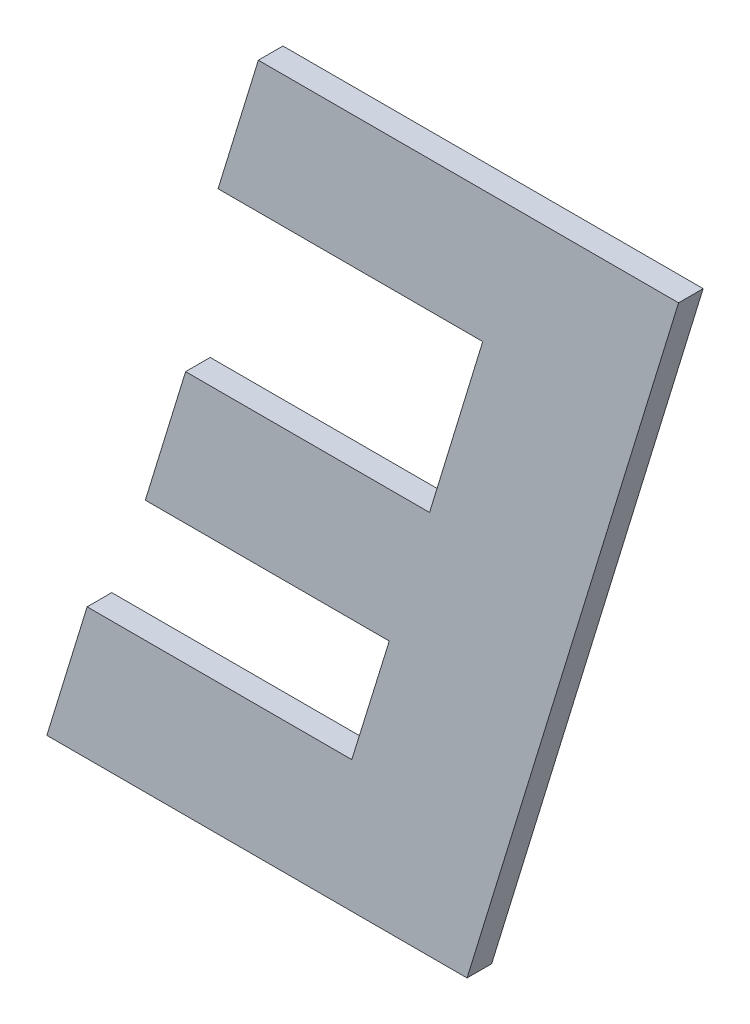
ISO-10303-21;
HEADER;
FILE_DESCRIPTION(('STEP AP214'),'2;1');
FILE_NAME('part.step','',(''),(''),'','','');
FILE_SCHEMA(('AUTOMOTIVE_DESIGN { 1 0 10303 214 1 1 1 1 }'));
ENDSEC;
DATA;
#1=APPLICATION_CONTEXT('core data for automotive mechanical design processes');
#2=APPLICATION_PROTOCOL_DEFINITION('international standard','automotive_design',2000,#1);
#3=PRODUCT_CONTEXT('',#1,'mechanical');
#4=PRODUCT('Part','Part','',(#3));
#5=PRODUCT_RELATED_PRODUCT_CATEGORY('part','',(#4));
#6=PRODUCT_DEFINITION_FORMATION('','',#4);
#7=PRODUCT_DEFINITION_CONTEXT('part definition',#1,'design');
#8=PRODUCT_DEFINITION('design','',#6,#7);
#9=PRODUCT_DEFINITION_SHAPE('','',#8);
#10=(LENGTH_UNIT() NAMED_UNIT(*) SI_UNIT(.MILLI.,.METRE.));
#11=(NAMED_UNIT(*) PLANE_ANGLE_UNIT() SI_UNIT($,.RADIAN.));
#12=(NAMED_UNIT(*) SI_UNIT($,.STERADIAN.) SOLID_ANGLE_UNIT());
#13=UNCERTAINTY_MEASURE_WITH_UNIT(LENGTH_MEASURE(1.E-05),#10,'distance_accuracy_value','');
#14=(GEOMETRIC_REPRESENTATION_CONTEXT(3) GLOBAL_UNCERTAINTY_ASSIGNED_CONTEXT((#13)) GLOBAL_UNIT_ASSIGNED_CONTEXT((#10,
#11,#12)) REPRESENTATION_CONTEXT('',''));
#15=CARTESIAN_POINT('',(0.,0.,0.));
#16=DIRECTION('',(0.,0.,1.));
#17=DIRECTION('',(1.,0.,0.));
#18=AXIS2_PLACEMENT_3D('',#15,#16,#17);
#19=CARTESIAN_POINT('',(-3.756402329819,-2.490905102371,0.));
#20=DIRECTION('',(0.,-1.,0.));
#21=DIRECTION('',(1.,0.,0.));
#22=AXIS2_PLACEMENT_3D('',#19,#20,#21);
#23=PLANE('',#22);
#24=DIRECTION('',(-1.,0.,0.));
#25=VECTOR('',#24,1.);
#26=CARTESIAN_POINT('',(-2.047481656679,-2.490905102371,0.));
#27=LINE('',#26,#25);
#28=CARTESIAN_POINT('',(-2.047481656679,-2.490905102371,0.));
#29=VERTEX_POINT('',#28);
#30=CARTESIAN_POINT('',(-3.756402329819,-2.490905102371,0.));
#31=VERTEX_POINT('',#30);
#32=EDGE_CURVE('E11',#29,#31,#27,.T.);
#33=ORIENTED_EDGE('',*,*,#32,.F.);
#34=DIRECTION('',(0.,0.,1.));
#35=VECTOR('',#34,1.);
#36=CARTESIAN_POINT('',(-2.047481656679,-2.490905102371,0.));
#37=LINE('',#36,#35);
#38=CARTESIAN_POINT('',(-2.047481656679,-2.490905102371,0.1));
#39=VERTEX_POINT('',#38);
#40=EDGE_CURVE('E24',#29,#39,#37,.T.);
#41=ORIENTED_EDGE('',*,*,#40,.T.);
#42=DIRECTION('',(1.,0.,0.));
#43=VECTOR('',#42,1.);
#44=CARTESIAN_POINT('',(-2.047481656679,-2.490905102371,0.1));
#45=LINE('',#44,#43);
#46=CARTESIAN_POINT('',(-3.756402329819,-2.490905102371,0.1));
#47=VERTEX_POINT('',#46);
#48=EDGE_CURVE('E124',#47,#39,#45,.T.);
#49=ORIENTED_EDGE('',*,*,#48,.F.);
#50=DIRECTION('',(0.,0.,1.));
#51=VECTOR('',#50,1.);
#52=CARTESIAN_POINT('',(-3.756402329819,-2.490905102371,0.));
#53=LINE('',#52,#51);
#54=EDGE_CURVE('E197',#31,#47,#53,.T.);
#55=ORIENTED_EDGE('',*,*,#54,.F.);
#56=EDGE_LOOP('',(#33,#41,#49,#55));
#57=FACE_BOUND('',#56,.T.);
#58=ADVANCED_FACE('F17',(#57),#23,.T.);
#59=CARTESIAN_POINT('',(-3.592564395776,-1.956156289871,0.));
#60=DIRECTION('',(-0.956130206843128,0.292942020820021,0.));
#61=DIRECTION('',(-0.292942020820021,-0.956130206843128,0.));
#62=AXIS2_PLACEMENT_3D('',#59,#60,#61);
#63=PLANE('',#62);
#64=DIRECTION('',(0.292942020820021,0.956130206843128,0.));
#65=VECTOR('',#64,1.);
#66=CARTESIAN_POINT('',(-3.756402329819,-2.490905102371,0.));
#67=LINE('',#66,#65);
#68=CARTESIAN_POINT('',(-3.592564395776,-1.956156289871,0.));
#69=VERTEX_POINT('',#68);
#70=EDGE_CURVE('E195',#31,#69,#67,.T.);
#71=ORIENTED_EDGE('',*,*,#70,.F.);
#72=ORIENTED_EDGE('',*,*,#54,.T.);
#73=DIRECTION('',(-0.292942020820021,-0.956130206843128,0.));
#74=VECTOR('',#73,1.);
#75=CARTESIAN_POINT('',(-3.756402329819,-2.490905102371,0.1));
#76=LINE('',#75,#74);
#77=CARTESIAN_POINT('',(-3.592564395776,-1.956156289871,0.1));
#78=VERTEX_POINT('',#77);
#79=EDGE_CURVE('E193',#78,#47,#76,.T.);
#80=ORIENTED_EDGE('',*,*,#79,.F.);
#81=DIRECTION('',(0.,0.,1.));
#82=VECTOR('',#81,1.);
#83=CARTESIAN_POINT('',(-3.592564395776,-1.956156289871,0.));
#84=LINE('',#83,#82);
#85=EDGE_CURVE('E190',#69,#78,#84,.T.);
#86=ORIENTED_EDGE('',*,*,#85,.F.);
#87=EDGE_LOOP('',(#71,#72,#80,#86));
#88=FACE_BOUND('',#87,.T.);
#89=ADVANCED_FACE('F235',(#88),#63,.T.);
#90=CARTESIAN_POINT('',(-2.51624019019,-1.956156289871,0.));
#91=DIRECTION('',(0.,1.,0.));
#92=DIRECTION('',(-1.,0.,0.));
#93=AXIS2_PLACEMENT_3D('',#90,#91,#92);
#94=PLANE('',#93);
#95=DIRECTION('',(1.,0.,0.));
#96=VECTOR('',#95,1.);
#97=CARTESIAN_POINT('',(-3.592564395776,-1.956156289871,0.));
#98=LINE('',#97,#96);
#99=CARTESIAN_POINT('',(-2.51624019019,-1.956156289871,0.));
#100=VERTEX_POINT('',#99);
#101=EDGE_CURVE('E188',#69,#100,#98,.T.);
#102=ORIENTED_EDGE('',*,*,#101,.F.);
#103=ORIENTED_EDGE('',*,*,#85,.T.);
#104=DIRECTION('',(-1.,0.,0.));
#105=VECTOR('',#104,1.);
#106=CARTESIAN_POINT('',(-3.592564395776,-1.956156289871,0.1));
#107=LINE('',#106,#105);
#108=CARTESIAN_POINT('',(-2.51624019019,-1.956156289871,0.1));
#109=VERTEX_POINT('',#108);
#110=EDGE_CURVE('E185',#109,#78,#107,.T.);
#111=ORIENTED_EDGE('',*,*,#110,.F.);
#112=DIRECTION('',(0.,0.,1.));
#113=VECTOR('',#112,1.);
#114=CARTESIAN_POINT('',(-2.51624019019,-1.956156289871,0.));
#115=LINE('',#114,#113);
#116=EDGE_CURVE('E182',#100,#109,#115,.T.);
#117=ORIENTED_EDGE('',*,*,#116,.F.);
#118=EDGE_LOOP('',(#102,#103,#111,#117));
#119=FACE_BOUND('',#118,.T.);
#120=ADVANCED_FACE('F231',(#119),#94,.T.);
#121=CARTESIAN_POINT('',(-2.363779890456,-1.462366960881,0.));
#122=DIRECTION('',(-0.955492945435698,0.295013950894893,0.));
#123=DIRECTION('',(-0.295013950894893,-0.955492945435698,0.));
#124=AXIS2_PLACEMENT_3D('',#121,#122,#123);
#125=PLANE('',#124);
#126=DIRECTION('',(0.295013950894893,0.955492945435698,0.));
#127=VECTOR('',#126,1.);
#128=CARTESIAN_POINT('',(-2.51624019019,-1.956156289871,0.));
#129=LINE('',#128,#127);
#130=CARTESIAN_POINT('',(-2.363779890456,-1.462366960881,0.));
#131=VERTEX_POINT('',#130);
#132=EDGE_CURVE('E180',#100,#131,#129,.T.);
#133=ORIENTED_EDGE('',*,*,#132,.F.);
#134=ORIENTED_EDGE('',*,*,#116,.T.);
#135=DIRECTION('',(-0.295013950894893,-0.955492945435698,0.));
#136=VECTOR('',#135,1.);
#137=CARTESIAN_POINT('',(-2.51624019019,-1.956156289871,0.1));
#138=LINE('',#137,#136);
#139=CARTESIAN_POINT('',(-2.363779890456,-1.462366960881,0.1));
#140=VERTEX_POINT('',#139);
#141=EDGE_CURVE('E177',#140,#109,#138,.T.);
#142=ORIENTED_EDGE('',*,*,#141,.F.);
#143=DIRECTION('',(0.,0.,1.));
#144=VECTOR('',#143,1.);
#145=CARTESIAN_POINT('',(-2.363779890456,-1.462366960881,0.));
#146=LINE('',#145,#144);
#147=EDGE_CURVE('E174',#131,#140,#146,.T.);
#148=ORIENTED_EDGE('',*,*,#147,.F.);
#149=EDGE_LOOP('',(#133,#134,#142,#148));
#150=FACE_BOUND('',#149,.T.);
#151=ADVANCED_FACE('F227',(#150),#125,.T.);
#152=CARTESIAN_POINT('',(-3.355909602159,-1.462366960881,0.));
#153=DIRECTION('',(0.,-1.,0.));
#154=DIRECTION('',(1.,0.,0.));
#155=AXIS2_PLACEMENT_3D('',#152,#153,#154);
#156=PLANE('',#155);
#157=DIRECTION('',(-1.,0.,0.));
#158=VECTOR('',#157,1.);
#159=CARTESIAN_POINT('',(-2.363779890456,-1.462366960881,0.));
#160=LINE('',#159,#158);
#161=CARTESIAN_POINT('',(-3.355909602159,-1.462366960881,0.));
#162=VERTEX_POINT('',#161);
#163=EDGE_CURVE('E172',#131,#162,#160,.T.);
#164=ORIENTED_EDGE('',*,*,#163,.F.);
#165=ORIENTED_EDGE('',*,*,#147,.T.);
#166=DIRECTION('',(1.,0.,0.));
#167=VECTOR('',#166,1.);
#168=CARTESIAN_POINT('',(-2.363779890456,-1.462366960881,0.1));
#169=LINE('',#168,#167);
#170=CARTESIAN_POINT('',(-3.355909602159,-1.462366960881,0.1));
#171=VERTEX_POINT('',#170);
#172=EDGE_CURVE('E169',#171,#140,#169,.T.);
#173=ORIENTED_EDGE('',*,*,#172,.F.);
#174=DIRECTION('',(0.,0.,1.));
#175=VECTOR('',#174,1.);
#176=CARTESIAN_POINT('',(-3.355909602159,-1.462366960881,0.));
#177=LINE('',#176,#175);
#178=EDGE_CURVE('E166',#162,#171,#177,.T.);
#179=ORIENTED_EDGE('',*,*,#178,.F.);
#180=EDGE_LOOP('',(#164,#165,#173,#179));
#181=FACE_BOUND('',#180,.T.);
#182=ADVANCED_FACE('F223',(#181),#156,.T.);
#183=CARTESIAN_POINT('',(-3.192071668116,-0.9276181483808,0.));
#184=DIRECTION('',(-0.956130206843128,0.292942020820021,0.));
#185=DIRECTION('',(-0.292942020820021,-0.956130206843128,0.));
#186=AXIS2_PLACEMENT_3D('',#183,#184,#185);
#187=PLANE('',#186);
#188=DIRECTION('',(0.292942020820021,0.956130206843128,0.));
#189=VECTOR('',#188,1.);
#190=CARTESIAN_POINT('',(-3.355909602159,-1.462366960881,0.));
#191=LINE('',#190,#189);
#192=CARTESIAN_POINT('',(-3.192071668116,-0.9276181483808,0.));
#193=VERTEX_POINT('',#192);
#194=EDGE_CURVE('E164',#162,#193,#191,.T.);
#195=ORIENTED_EDGE('',*,*,#194,.F.);
#196=ORIENTED_EDGE('',*,*,#178,.T.);
#197=DIRECTION('',(-0.292942020820021,-0.956130206843128,0.));
#198=VECTOR('',#197,1.);
#199=CARTESIAN_POINT('',(-3.355909602159,-1.462366960881,0.1));
#200=LINE('',#199,#198);
#201=CARTESIAN_POINT('',(-3.192071668116,-0.9276181483808,0.1));
#202=VERTEX_POINT('',#201);
#203=EDGE_CURVE('E161',#202,#171,#200,.T.);
#204=ORIENTED_EDGE('',*,*,#203,.F.);
#205=DIRECTION('',(0.,0.,1.));
#206=VECTOR('',#205,1.);
#207=CARTESIAN_POINT('',(-3.192071668116,-0.9276181483808,0.));
#208=LINE('',#207,#206);
#209=EDGE_CURVE('E158',#193,#202,#208,.T.);
#210=ORIENTED_EDGE('',*,*,#209,.F.);
#211=EDGE_LOOP('',(#195,#196,#204,#210));
#212=FACE_BOUND('',#211,.T.);
#213=ADVANCED_FACE('F219',(#212),#187,.T.);
#214=CARTESIAN_POINT('',(-2.199941956413,-0.9276181483808,0.));
#215=DIRECTION('',(0.,1.,0.));
#216=DIRECTION('',(-1.,0.,0.));
#217=AXIS2_PLACEMENT_3D('',#214,#215,#216);
#218=PLANE('',#217);
#219=DIRECTION('',(1.,0.,0.));
#220=VECTOR('',#219,1.);
#221=CARTESIAN_POINT('',(-3.192071668116,-0.9276181483808,0.));
#222=LINE('',#221,#220);
#223=CARTESIAN_POINT('',(-2.199941956413,-0.9276181483808,0.));
#224=VERTEX_POINT('',#223);
#225=EDGE_CURVE('E156',#193,#224,#222,.T.);
#226=ORIENTED_EDGE('',*,*,#225,.F.);
#227=ORIENTED_EDGE('',*,*,#209,.T.);
#228=DIRECTION('',(-1.,0.,0.));
#229=VECTOR('',#228,1.);
#230=CARTESIAN_POINT('',(-3.192071668116,-0.9276181483808,0.1));
#231=LINE('',#230,#229);
#232=CARTESIAN_POINT('',(-2.199941956413,-0.9276181483808,0.1));
#233=VERTEX_POINT('',#232);
#234=EDGE_CURVE('E153',#233,#202,#231,.T.);
#235=ORIENTED_EDGE('',*,*,#234,.F.);
#236=DIRECTION('',(0.,0.,1.));
#237=VECTOR('',#236,1.);
#238=CARTESIAN_POINT('',(-2.199941956413,-0.9276181483808,0.));
#239=LINE('',#238,#237);
#240=EDGE_CURVE('E150',#224,#233,#239,.T.);
#241=ORIENTED_EDGE('',*,*,#240,.F.);
#242=EDGE_LOOP('',(#226,#227,#235,#241));
#243=FACE_BOUND('',#242,.T.);
#244=ADVANCED_FACE('F215',(#243),#218,.T.);
#245=CARTESIAN_POINT('',(-1.983766904551,-0.217653767529166,0.));
#246=DIRECTION('',(-0.95663673942414,0.291283622581069,0.));
#247=DIRECTION('',(-0.291283622581069,-0.95663673942414,0.));
#248=AXIS2_PLACEMENT_3D('',#245,#246,#247);
#249=PLANE('',#248);
#250=DIRECTION('',(0.291283622581068,0.95663673942414,0.));
#251=VECTOR('',#250,1.);
#252=CARTESIAN_POINT('',(-2.199941956413,-0.9276181483808,0.));
#253=LINE('',#252,#251);
#254=CARTESIAN_POINT('',(-1.983766904551,-0.217653767529166,0.));
#255=VERTEX_POINT('',#254);
#256=EDGE_CURVE('E148',#224,#255,#253,.T.);
#257=ORIENTED_EDGE('',*,*,#256,.F.);
#258=ORIENTED_EDGE('',*,*,#240,.T.);
#259=DIRECTION('',(-0.291283622581068,-0.95663673942414,0.));
#260=VECTOR('',#259,1.);
#261=CARTESIAN_POINT('',(-2.199941956413,-0.9276181483808,0.1));
#262=LINE('',#261,#260);
#263=CARTESIAN_POINT('',(-1.983766904551,-0.217653767529166,0.1));
#264=VERTEX_POINT('',#263);
#265=EDGE_CURVE('E145',#264,#233,#262,.T.);
#266=ORIENTED_EDGE('',*,*,#265,.F.);
#267=DIRECTION('',(0.,0.,1.));
#268=VECTOR('',#267,1.);
#269=CARTESIAN_POINT('',(-1.983766904551,-0.217653767529166,0.));
#270=LINE('',#269,#268);
#271=EDGE_CURVE('E142',#255,#264,#270,.T.);
#272=ORIENTED_EDGE('',*,*,#271,.F.);
#273=EDGE_LOOP('',(#257,#258,#266,#272));
#274=FACE_BOUND('',#273,.T.);
#275=ADVANCED_FACE('F211',(#274),#249,.T.);
#276=CARTESIAN_POINT('',(-3.060091110137,-0.217653767529165,0.));
#277=DIRECTION('',(0.,-1.,0.));
#278=DIRECTION('',(1.,0.,0.));
#279=AXIS2_PLACEMENT_3D('',#276,#277,#278);
#280=PLANE('',#279);
#281=DIRECTION('',(-1.,0.,0.));
#282=VECTOR('',#281,1.);
#283=CARTESIAN_POINT('',(-1.983766904551,-0.217653767529166,0.));
#284=LINE('',#283,#282);
#285=CARTESIAN_POINT('',(-3.060091110137,-0.217653767529165,0.));
#286=VERTEX_POINT('',#285);
#287=EDGE_CURVE('E140',#255,#286,#284,.T.);
#288=ORIENTED_EDGE('',*,*,#287,.F.);
#289=ORIENTED_EDGE('',*,*,#271,.T.);
#290=DIRECTION('',(1.,0.,0.));
#291=VECTOR('',#290,1.);
#292=CARTESIAN_POINT('',(-1.983766904551,-0.217653767529166,0.1));
#293=LINE('',#292,#291);
#294=CARTESIAN_POINT('',(-3.060091110137,-0.217653767529165,0.1));
#295=VERTEX_POINT('',#294);
#296=EDGE_CURVE('E137',#295,#264,#293,.T.);
#297=ORIENTED_EDGE('',*,*,#296,.F.);
#298=DIRECTION('',(0.,0.,1.));
#299=VECTOR('',#298,1.);
#300=CARTESIAN_POINT('',(-3.060091110137,-0.217653767529165,0.));
#301=LINE('',#300,#299);
#302=EDGE_CURVE('E134',#286,#295,#301,.T.);
#303=ORIENTED_EDGE('',*,*,#302,.F.);
#304=EDGE_LOOP('',(#288,#289,#297,#303));
#305=FACE_BOUND('',#304,.T.);
#306=ADVANCED_FACE('F207',(#305),#280,.T.);
#307=CARTESIAN_POINT('',(-2.896253176095,0.317095044971265,0.));
#308=DIRECTION('',(-0.956130206843127,0.292942020820023,0.));
#309=DIRECTION('',(-0.292942020820023,-0.956130206843127,0.));
#310=AXIS2_PLACEMENT_3D('',#307,#308,#309);
#311=PLANE('',#310);
#312=DIRECTION('',(0.292942020820023,0.956130206843127,0.));
#313=VECTOR('',#312,1.);
#314=CARTESIAN_POINT('',(-3.060091110137,-0.217653767529165,0.));
#315=LINE('',#314,#313);
#316=CARTESIAN_POINT('',(-2.896253176095,0.317095044971264,0.));
#317=VERTEX_POINT('',#316);
#318=EDGE_CURVE('E132',#286,#317,#315,.T.);
#319=ORIENTED_EDGE('',*,*,#318,.F.);
#320=ORIENTED_EDGE('',*,*,#302,.T.);
#321=DIRECTION('',(-0.292942020820023,-0.956130206843127,0.));
#322=VECTOR('',#321,1.);
#323=CARTESIAN_POINT('',(-3.060091110137,-0.217653767529165,0.1));
#324=LINE('',#323,#322);
#325=CARTESIAN_POINT('',(-2.896253176095,0.317095044971264,0.1));
#326=VERTEX_POINT('',#325);
#327=EDGE_CURVE('E130',#326,#295,#324,.T.);
#328=ORIENTED_EDGE('',*,*,#327,.F.);
#329=DIRECTION('',(0.,0.,1.));
#330=VECTOR('',#329,1.);
#331=CARTESIAN_POINT('',(-2.896253176095,0.317095044971264,0.));
#332=LINE('',#331,#330);
#333=EDGE_CURVE('E109',#317,#326,#332,.T.);
#334=ORIENTED_EDGE('',*,*,#333,.F.);
#335=EDGE_LOOP('',(#319,#320,#328,#334));
#336=FACE_BOUND('',#335,.T.);
#337=ADVANCED_FACE('F205',(#336),#311,.T.);
#338=CARTESIAN_POINT('',(-1.187332502955,0.317095044971264,0.));
#339=DIRECTION('',(0.,1.,0.));
#340=DIRECTION('',(-1.,0.,0.));
#341=AXIS2_PLACEMENT_3D('',#338,#339,#340);
#342=PLANE('',#341);
#343=DIRECTION('',(1.,0.,0.));
#344=VECTOR('',#343,1.);
#345=CARTESIAN_POINT('',(-2.896253176095,0.317095044971264,0.));
#346=LINE('',#345,#344);
#347=CARTESIAN_POINT('',(-1.187332502955,0.317095044971264,0.));
#348=VERTEX_POINT('',#347);
#349=EDGE_CURVE('E113',#317,#348,#346,.T.);
#350=ORIENTED_EDGE('',*,*,#349,.F.);
#351=ORIENTED_EDGE('',*,*,#333,.T.);
#352=DIRECTION('',(-1.,0.,0.));
#353=VECTOR('',#352,1.);
#354=CARTESIAN_POINT('',(-2.896253176095,0.317095044971264,0.1));
#355=LINE('',#354,#353);
#356=CARTESIAN_POINT('',(-1.187332502955,0.317095044971264,0.1));
#357=VERTEX_POINT('',#356);
#358=EDGE_CURVE('E102',#357,#326,#355,.T.);
#359=ORIENTED_EDGE('',*,*,#358,.F.);
#360=DIRECTION('',(0.,0.,1.));
#361=VECTOR('',#360,1.);
#362=CARTESIAN_POINT('',(-1.187332502955,0.317095044971264,0.));
#363=LINE('',#362,#361);
#364=EDGE_CURVE('E106',#348,#357,#363,.T.);
#365=ORIENTED_EDGE('',*,*,#364,.F.);
#366=EDGE_LOOP('',(#350,#351,#359,#365));
#367=FACE_BOUND('',#366,.T.);
#368=ADVANCED_FACE('F105',(#367),#342,.T.);
#369=CARTESIAN_POINT('',(-2.047481656679,-2.490905102371,0.));
#370=DIRECTION('',(0.956146828433078,-0.292887764301218,0.));
#371=DIRECTION('',(0.292887764301218,0.956146828433078,0.));
#372=AXIS2_PLACEMENT_3D('',#369,#370,#371);
#373=PLANE('',#372);
#374=DIRECTION('',(-0.292887764301218,-0.956146828433078,0.));
#375=VECTOR('',#374,1.);
#376=CARTESIAN_POINT('',(-1.187332502955,0.317095044971264,0.));
#377=LINE('',#376,#375);
#378=EDGE_CURVE('E119',#348,#29,#377,.T.);
#379=ORIENTED_EDGE('',*,*,#378,.F.);
#380=ORIENTED_EDGE('',*,*,#364,.T.);
#381=DIRECTION('',(0.292887764301218,0.956146828433078,0.));
#382=VECTOR('',#381,1.);
#383=CARTESIAN_POINT('',(-1.187332502955,0.317095044971264,0.1));
#384=LINE('',#383,#382);
#385=EDGE_CURVE('E118',#39,#357,#384,.T.);
#386=ORIENTED_EDGE('',*,*,#385,.F.);
#387=ORIENTED_EDGE('',*,*,#40,.F.);
#388=EDGE_LOOP('',(#379,#380,#386,#387));
#389=FACE_BOUND('',#388,.T.);
#390=ADVANCED_FACE('F117',(#389),#373,.T.);
#391=CARTESIAN_POINT('',(-2.463281738702,-1.102907785908,0.));
#392=DIRECTION('',(0.,0.,1.));
#393=DIRECTION('',(1.,0.,0.));
#394=AXIS2_PLACEMENT_3D('',#391,#392,#393);
#395=PLANE('',#394);
#396=ORIENTED_EDGE('',*,*,#378,.T.);
#397=ORIENTED_EDGE('',*,*,#32,.T.);
#398=ORIENTED_EDGE('',*,*,#70,.T.);
#399=ORIENTED_EDGE('',*,*,#101,.T.);
#400=ORIENTED_EDGE('',*,*,#132,.T.);
#401=ORIENTED_EDGE('',*,*,#163,.T.);
#402=ORIENTED_EDGE('',*,*,#194,.T.);
#403=ORIENTED_EDGE('',*,*,#225,.T.);
#404=ORIENTED_EDGE('',*,*,#256,.T.);
#405=ORIENTED_EDGE('',*,*,#287,.T.);
#406=ORIENTED_EDGE('',*,*,#318,.T.);
#407=ORIENTED_EDGE('',*,*,#349,.T.);
#408=EDGE_LOOP('',(#396,#397,#398,#399,#400,#401,#402,#403,#404,#405,#406,#407));
#409=FACE_BOUND('',#408,.T.);
#410=ADVANCED_FACE('F200',(#409),#395,.F.);
#411=CARTESIAN_POINT('',(-2.463281738702,-1.102907785908,0.1));
#412=DIRECTION('',(0.,0.,1.));
#413=DIRECTION('',(1.,0.,0.));
#414=AXIS2_PLACEMENT_3D('',#411,#412,#413);
#415=PLANE('',#414);
#416=ORIENTED_EDGE('',*,*,#385,.T.);
#417=ORIENTED_EDGE('',*,*,#358,.T.);
#418=ORIENTED_EDGE('',*,*,#327,.T.);
#419=ORIENTED_EDGE('',*,*,#296,.T.);
#420=ORIENTED_EDGE('',*,*,#265,.T.);
#421=ORIENTED_EDGE('',*,*,#234,.T.);
#422=ORIENTED_EDGE('',*,*,#203,.T.);
#423=ORIENTED_EDGE('',*,*,#172,.T.);
#424=ORIENTED_EDGE('',*,*,#141,.T.);
#425=ORIENTED_EDGE('',*,*,#110,.T.);
#426=ORIENTED_EDGE('',*,*,#79,.T.);
#427=ORIENTED_EDGE('',*,*,#48,.T.);
#428=EDGE_LOOP('',(#416,#417,#418,#419,#420,#421,#422,#423,#424,#425,#426,#427));
#429=FACE_BOUND('',#428,.T.);
#430=ADVANCED_FACE('F122',(#429),#415,.T.);
#431=CLOSED_SHELL('',(#58,#89,#120,#151,#182,#213,#244,#275,#306,#337,#368,#390,#410,#430));
#432=MANIFOLD_SOLID_BREP('B1',#431);
#433=ADVANCED_BREP_SHAPE_REPRESENTATION('',(#18,#432),#14);
#434=SHAPE_DEFINITION_REPRESENTATION(#9,#433);
ENDSEC;
END-ISO-10303-21;
